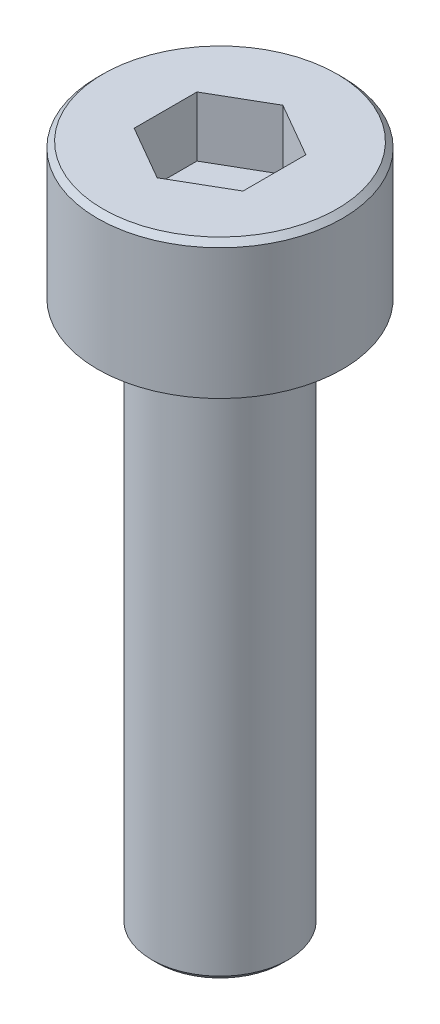
ISO-10303-21;
HEADER;
FILE_DESCRIPTION(('STEP AP214'),'2;1');
FILE_NAME('part.step','',(''),(''),'','','');
FILE_SCHEMA(('AUTOMOTIVE_DESIGN { 1 0 10303 214 1 1 1 1 }'));
ENDSEC;
DATA;
#1=APPLICATION_CONTEXT('core data for automotive mechanical design processes');
#2=APPLICATION_PROTOCOL_DEFINITION('international standard','automotive_design',2000,#1);
#3=PRODUCT_CONTEXT('',#1,'mechanical');
#4=PRODUCT('Part','Part','',(#3));
#5=PRODUCT_RELATED_PRODUCT_CATEGORY('part','',(#4));
#6=PRODUCT_DEFINITION_FORMATION('','',#4);
#7=PRODUCT_DEFINITION_CONTEXT('part definition',#1,'design');
#8=PRODUCT_DEFINITION('design','',#6,#7);
#9=PRODUCT_DEFINITION_SHAPE('','',#8);
#10=(LENGTH_UNIT() NAMED_UNIT(*) SI_UNIT(.MILLI.,.METRE.));
#11=(NAMED_UNIT(*) PLANE_ANGLE_UNIT() SI_UNIT($,.RADIAN.));
#12=(NAMED_UNIT(*) SI_UNIT($,.STERADIAN.) SOLID_ANGLE_UNIT());
#13=UNCERTAINTY_MEASURE_WITH_UNIT(LENGTH_MEASURE(1.E-05),#10,'distance_accuracy_value','');
#14=(GEOMETRIC_REPRESENTATION_CONTEXT(3) GLOBAL_UNCERTAINTY_ASSIGNED_CONTEXT((#13)) GLOBAL_UNIT_ASSIGNED_CONTEXT((#10,
#11,#12)) REPRESENTATION_CONTEXT('',''));
#15=CARTESIAN_POINT('',(0.,0.,0.));
#16=DIRECTION('',(0.,0.,1.));
#17=DIRECTION('',(1.,0.,0.));
#18=AXIS2_PLACEMENT_3D('',#15,#16,#17);
#19=CARTESIAN_POINT('',(1.25,-10.,0.));
#20=DIRECTION('',(0.,1.,0.));
#21=DIRECTION('',(0.,0.,1.));
#22=AXIS2_PLACEMENT_3D('',#19,#20,#21);
#23=PLANE('',#22);
#24=CARTESIAN_POINT('',(0.,-10.,0.));
#25=DIRECTION('',(0.,1.,0.));
#26=DIRECTION('',(0.,0.,1.));
#27=AXIS2_PLACEMENT_3D('',#24,#25,#26);
#28=CIRCLE('',#27,1.15000000000001);
#29=CARTESIAN_POINT('',(0.,-10.,1.15000000000001));
#30=VERTEX_POINT('',#29);
#31=EDGE_CURVE('E11',#30,#30,#28,.F.);
#32=ORIENTED_EDGE('',*,*,#31,.T.);
#33=EDGE_LOOP('',(#32));
#34=FACE_BOUND('',#33,.T.);
#35=ADVANCED_FACE('F34',(#34),#23,.F.);
#36=CARTESIAN_POINT('',(0.,2.5,0.));
#37=DIRECTION('',(0.,-1.,0.));
#38=DIRECTION('',(0.,0.,-1.));
#39=AXIS2_PLACEMENT_3D('',#36,#37,#38);
#40=PLANE('',#39);
#41=DIRECTION('',(-0.866025403784439,0.,0.5));
#42=VECTOR('',#41,1.);
#43=CARTESIAN_POINT('',(0.,2.5,-1.15470053837925));
#44=LINE('',#43,#42);
#45=CARTESIAN_POINT('',(0.,2.5,-1.15470053837925));
#46=VERTEX_POINT('',#45);
#47=CARTESIAN_POINT('',(-1.,2.5,-0.577350269189626));
#48=VERTEX_POINT('',#47);
#49=EDGE_CURVE('E123',#46,#48,#44,.T.);
#50=ORIENTED_EDGE('',*,*,#49,.F.);
#51=DIRECTION('',(-0.866025403784439,0.,-0.5));
#52=VECTOR('',#51,1.);
#53=CARTESIAN_POINT('',(1.,2.5,-0.577350269189626));
#54=LINE('',#53,#52);
#55=CARTESIAN_POINT('',(1.,2.5,-0.577350269189626));
#56=VERTEX_POINT('',#55);
#57=EDGE_CURVE('E49',#56,#46,#54,.T.);
#58=ORIENTED_EDGE('',*,*,#57,.F.);
#59=DIRECTION('',(0.,0.,-1.));
#60=VECTOR('',#59,1.);
#61=CARTESIAN_POINT('',(1.,2.5,0.577350269189626));
#62=LINE('',#61,#60);
#63=CARTESIAN_POINT('',(1.,2.5,0.577350269189626));
#64=VERTEX_POINT('',#63);
#65=EDGE_CURVE('E132',#64,#56,#62,.T.);
#66=ORIENTED_EDGE('',*,*,#65,.F.);
#67=DIRECTION('',(0.866025403784439,0.,-0.5));
#68=VECTOR('',#67,1.);
#69=CARTESIAN_POINT('',(0.,2.5,1.15470053837925));
#70=LINE('',#69,#68);
#71=CARTESIAN_POINT('',(0.,2.5,1.15470053837925));
#72=VERTEX_POINT('',#71);
#73=EDGE_CURVE('E130',#72,#64,#70,.T.);
#74=ORIENTED_EDGE('',*,*,#73,.F.);
#75=DIRECTION('',(0.866025403784438,0.,0.5));
#76=VECTOR('',#75,1.);
#77=CARTESIAN_POINT('',(-1.,2.5,0.577350269189626));
#78=LINE('',#77,#76);
#79=CARTESIAN_POINT('',(-1.,2.5,0.577350269189626));
#80=VERTEX_POINT('',#79);
#81=EDGE_CURVE('E97',#80,#72,#78,.T.);
#82=ORIENTED_EDGE('',*,*,#81,.F.);
#83=DIRECTION('',(0.,0.,1.));
#84=VECTOR('',#83,1.);
#85=CARTESIAN_POINT('',(-1.,2.5,-0.577350269189626));
#86=LINE('',#85,#84);
#87=EDGE_CURVE('E126',#48,#80,#86,.T.);
#88=ORIENTED_EDGE('',*,*,#87,.F.);
#89=EDGE_LOOP('',(#50,#58,#66,#74,#82,#88));
#90=FACE_BOUND('',#89,.T.);
#91=CARTESIAN_POINT('',(0.,2.5,0.));
#92=DIRECTION('',(0.,-1.,0.));
#93=DIRECTION('',(0.,0.,-1.));
#94=AXIS2_PLACEMENT_3D('',#91,#92,#93);
#95=CIRCLE('',#94,2.15000000000001);
#96=CARTESIAN_POINT('',(0.,2.5,-2.15000000000001));
#97=VERTEX_POINT('',#96);
#98=EDGE_CURVE('E147',#97,#97,#95,.F.);
#99=ORIENTED_EDGE('',*,*,#98,.T.);
#100=EDGE_LOOP('',(#99));
#101=FACE_BOUND('',#100,.T.);
#102=ADVANCED_FACE('F171',(#90,#101),#40,.F.);
#103=CARTESIAN_POINT('',(0.,28.3884819972091,0.));
#104=DIRECTION('',(0.,1.,0.));
#105=DIRECTION('',(0.,0.,1.));
#106=AXIS2_PLACEMENT_3D('',#103,#104,#105);
#107=CYLINDRICAL_SURFACE('',#106,2.25);
#108=CARTESIAN_POINT('',(0.,2.4,0.));
#109=DIRECTION('',(0.,-1.,0.));
#110=DIRECTION('',(0.,0.,-1.));
#111=AXIS2_PLACEMENT_3D('',#108,#109,#110);
#112=CIRCLE('',#111,2.25);
#113=CARTESIAN_POINT('',(0.,2.4,-2.25));
#114=VERTEX_POINT('',#113);
#115=EDGE_CURVE('E150',#114,#114,#112,.T.);
#116=ORIENTED_EDGE('',*,*,#115,.T.);
#117=EDGE_LOOP('',(#116));
#118=FACE_BOUND('',#117,.T.);
#119=CARTESIAN_POINT('',(0.,0.,0.));
#120=DIRECTION('',(0.,1.,0.));
#121=DIRECTION('',(0.,0.,1.));
#122=AXIS2_PLACEMENT_3D('',#119,#120,#121);
#123=CIRCLE('',#122,2.25);
#124=CARTESIAN_POINT('',(0.,0.,2.25));
#125=VERTEX_POINT('',#124);
#126=EDGE_CURVE('E144',#125,#125,#123,.T.);
#127=ORIENTED_EDGE('',*,*,#126,.T.);
#128=EDGE_LOOP('',(#127));
#129=FACE_BOUND('',#128,.T.);
#130=ADVANCED_FACE('F177',(#118,#129),#107,.T.);
#131=CARTESIAN_POINT('',(2.25,0.,0.));
#132=DIRECTION('',(0.,1.,0.));
#133=DIRECTION('',(0.,0.,1.));
#134=AXIS2_PLACEMENT_3D('',#131,#132,#133);
#135=PLANE('',#134);
#136=ORIENTED_EDGE('',*,*,#126,.F.);
#137=EDGE_LOOP('',(#136));
#138=FACE_BOUND('',#137,.T.);
#139=CARTESIAN_POINT('',(0.,0.,0.));
#140=DIRECTION('',(0.,1.,0.));
#141=DIRECTION('',(0.,0.,1.));
#142=AXIS2_PLACEMENT_3D('',#139,#140,#141);
#143=CIRCLE('',#142,1.25);
#144=CARTESIAN_POINT('',(0.,0.,1.25));
#145=VERTEX_POINT('',#144);
#146=EDGE_CURVE('E136',#145,#145,#143,.T.);
#147=ORIENTED_EDGE('',*,*,#146,.T.);
#148=EDGE_LOOP('',(#147));
#149=FACE_BOUND('',#148,.T.);
#150=ADVANCED_FACE('F183',(#138,#149),#135,.F.);
#151=CARTESIAN_POINT('',(0.,28.3884819972091,0.));
#152=DIRECTION('',(0.,1.,0.));
#153=DIRECTION('',(0.,0.,1.));
#154=AXIS2_PLACEMENT_3D('',#151,#152,#153);
#155=CYLINDRICAL_SURFACE('',#154,1.25);
#156=CARTESIAN_POINT('',(0.,-9.9,0.));
#157=DIRECTION('',(0.,1.,0.));
#158=DIRECTION('',(0.,0.,1.));
#159=AXIS2_PLACEMENT_3D('',#156,#157,#158);
#160=CIRCLE('',#159,1.25);
#161=CARTESIAN_POINT('',(0.,-9.9,1.25));
#162=VERTEX_POINT('',#161);
#163=EDGE_CURVE('E42',#162,#162,#160,.T.);
#164=ORIENTED_EDGE('',*,*,#163,.T.);
#165=EDGE_LOOP('',(#164));
#166=FACE_BOUND('',#165,.T.);
#167=ORIENTED_EDGE('',*,*,#146,.F.);
#168=EDGE_LOOP('',(#167));
#169=FACE_BOUND('',#168,.T.);
#170=ADVANCED_FACE('F155',(#166,#169),#155,.T.);
#171=CARTESIAN_POINT('',(0.,2.5,0.));
#172=DIRECTION('',(0.,-1.,0.));
#173=DIRECTION('',(0.,0.,-1.));
#174=AXIS2_PLACEMENT_3D('',#171,#172,#173);
#175=CONICAL_SURFACE('',#174,2.15000000000001,0.785398163397448);
#176=ORIENTED_EDGE('',*,*,#115,.F.);
#177=EDGE_LOOP('',(#176));
#178=FACE_BOUND('',#177,.T.);
#179=ORIENTED_EDGE('',*,*,#98,.F.);
#180=EDGE_LOOP('',(#179));
#181=FACE_BOUND('',#180,.T.);
#182=ADVANCED_FACE('F160',(#178,#181),#175,.T.);
#183=CARTESIAN_POINT('',(0.,-9.9,0.));
#184=DIRECTION('',(0.,1.,0.));
#185=DIRECTION('',(0.,0.,1.));
#186=AXIS2_PLACEMENT_3D('',#183,#184,#185);
#187=CONICAL_SURFACE('',#186,1.25,0.785398163397429);
#188=ORIENTED_EDGE('',*,*,#31,.F.);
#189=EDGE_LOOP('',(#188));
#190=FACE_BOUND('',#189,.T.);
#191=ORIENTED_EDGE('',*,*,#163,.F.);
#192=EDGE_LOOP('',(#191));
#193=FACE_BOUND('',#192,.T.);
#194=ADVANCED_FACE('F36',(#190,#193),#187,.T.);
#195=CARTESIAN_POINT('',(1.,1.4,-0.577350269189626));
#196=DIRECTION('',(0.5,0.,-0.866025403784439));
#197=DIRECTION('',(-0.866025403784439,0.,-0.5));
#198=AXIS2_PLACEMENT_3D('',#195,#196,#197);
#199=PLANE('',#198);
#200=ORIENTED_EDGE('',*,*,#57,.T.);
#201=DIRECTION('',(0.,1.,0.));
#202=VECTOR('',#201,1.);
#203=CARTESIAN_POINT('',(0.,1.4,-1.15470053837925));
#204=LINE('',#203,#202);
#205=CARTESIAN_POINT('',(0.,1.4,-1.15470053837925));
#206=VERTEX_POINT('',#205);
#207=EDGE_CURVE('E79',#206,#46,#204,.T.);
#208=ORIENTED_EDGE('',*,*,#207,.F.);
#209=DIRECTION('',(-0.866025403784439,0.,-0.5));
#210=VECTOR('',#209,1.);
#211=CARTESIAN_POINT('',(1.,1.4,-0.577350269189626));
#212=LINE('',#211,#210);
#213=CARTESIAN_POINT('',(1.,1.4,-0.577350269189626));
#214=VERTEX_POINT('',#213);
#215=EDGE_CURVE('E134',#214,#206,#212,.T.);
#216=ORIENTED_EDGE('',*,*,#215,.F.);
#217=DIRECTION('',(0.,1.,0.));
#218=VECTOR('',#217,1.);
#219=CARTESIAN_POINT('',(1.,1.4,-0.577350269189626));
#220=LINE('',#219,#218);
#221=EDGE_CURVE('E57',#214,#56,#220,.T.);
#222=ORIENTED_EDGE('',*,*,#221,.T.);
#223=EDGE_LOOP('',(#200,#208,#216,#222));
#224=FACE_BOUND('',#223,.T.);
#225=ADVANCED_FACE('F159',(#224),#199,.F.);
#226=CARTESIAN_POINT('',(1.,1.4,0.577350269189626));
#227=DIRECTION('',(1.,0.,0.));
#228=DIRECTION('',(0.,0.,-1.));
#229=AXIS2_PLACEMENT_3D('',#226,#227,#228);
#230=PLANE('',#229);
#231=ORIENTED_EDGE('',*,*,#65,.T.);
#232=ORIENTED_EDGE('',*,*,#221,.F.);
#233=DIRECTION('',(0.,0.,-1.));
#234=VECTOR('',#233,1.);
#235=CARTESIAN_POINT('',(1.,1.4,0.577350269189626));
#236=LINE('',#235,#234);
#237=CARTESIAN_POINT('',(1.,1.4,0.577350269189626));
#238=VERTEX_POINT('',#237);
#239=EDGE_CURVE('E109',#238,#214,#236,.T.);
#240=ORIENTED_EDGE('',*,*,#239,.F.);
#241=DIRECTION('',(0.,1.,0.));
#242=VECTOR('',#241,1.);
#243=CARTESIAN_POINT('',(1.,1.4,0.577350269189626));
#244=LINE('',#243,#242);
#245=EDGE_CURVE('E101',#238,#64,#244,.T.);
#246=ORIENTED_EDGE('',*,*,#245,.T.);
#247=EDGE_LOOP('',(#231,#232,#240,#246));
#248=FACE_BOUND('',#247,.T.);
#249=ADVANCED_FACE('F166',(#248),#230,.F.);
#250=CARTESIAN_POINT('',(0.,1.4,1.15470053837925));
#251=DIRECTION('',(0.5,0.,0.866025403784439));
#252=DIRECTION('',(0.866025403784439,0.,-0.5));
#253=AXIS2_PLACEMENT_3D('',#250,#251,#252);
#254=PLANE('',#253);
#255=ORIENTED_EDGE('',*,*,#73,.T.);
#256=ORIENTED_EDGE('',*,*,#245,.F.);
#257=DIRECTION('',(0.866025403784439,0.,-0.5));
#258=VECTOR('',#257,1.);
#259=CARTESIAN_POINT('',(0.,1.4,1.15470053837925));
#260=LINE('',#259,#258);
#261=CARTESIAN_POINT('',(0.,1.4,1.15470053837925));
#262=VERTEX_POINT('',#261);
#263=EDGE_CURVE('E105',#262,#238,#260,.T.);
#264=ORIENTED_EDGE('',*,*,#263,.F.);
#265=DIRECTION('',(0.,1.,0.));
#266=VECTOR('',#265,1.);
#267=CARTESIAN_POINT('',(0.,1.4,1.15470053837925));
#268=LINE('',#267,#266);
#269=EDGE_CURVE('E90',#262,#72,#268,.T.);
#270=ORIENTED_EDGE('',*,*,#269,.T.);
#271=EDGE_LOOP('',(#255,#256,#264,#270));
#272=FACE_BOUND('',#271,.T.);
#273=ADVANCED_FACE('F106',(#272),#254,.F.);
#274=CARTESIAN_POINT('',(-1.,1.4,0.577350269189626));
#275=DIRECTION('',(-0.5,0.,0.866025403784439));
#276=DIRECTION('',(0.866025403784438,0.,0.5));
#277=AXIS2_PLACEMENT_3D('',#274,#275,#276);
#278=PLANE('',#277);
#279=ORIENTED_EDGE('',*,*,#81,.T.);
#280=ORIENTED_EDGE('',*,*,#269,.F.);
#281=DIRECTION('',(0.866025403784438,0.,0.5));
#282=VECTOR('',#281,1.);
#283=CARTESIAN_POINT('',(-1.,1.4,0.577350269189626));
#284=LINE('',#283,#282);
#285=CARTESIAN_POINT('',(-1.,1.4,0.577350269189626));
#286=VERTEX_POINT('',#285);
#287=EDGE_CURVE('E94',#286,#262,#284,.T.);
#288=ORIENTED_EDGE('',*,*,#287,.F.);
#289=DIRECTION('',(0.,1.,0.));
#290=VECTOR('',#289,1.);
#291=CARTESIAN_POINT('',(-1.,1.4,0.577350269189626));
#292=LINE('',#291,#290);
#293=EDGE_CURVE('E102',#286,#80,#292,.T.);
#294=ORIENTED_EDGE('',*,*,#293,.T.);
#295=EDGE_LOOP('',(#279,#280,#288,#294));
#296=FACE_BOUND('',#295,.T.);
#297=ADVANCED_FACE('F92',(#296),#278,.F.);
#298=CARTESIAN_POINT('',(-1.,1.4,-0.577350269189626));
#299=DIRECTION('',(-1.,0.,0.));
#300=DIRECTION('',(0.,0.,1.));
#301=AXIS2_PLACEMENT_3D('',#298,#299,#300);
#302=PLANE('',#301);
#303=ORIENTED_EDGE('',*,*,#87,.T.);
#304=ORIENTED_EDGE('',*,*,#293,.F.);
#305=DIRECTION('',(0.,0.,1.));
#306=VECTOR('',#305,1.);
#307=CARTESIAN_POINT('',(-1.,1.4,-0.577350269189626));
#308=LINE('',#307,#306);
#309=CARTESIAN_POINT('',(-1.,1.4,-0.577350269189626));
#310=VERTEX_POINT('',#309);
#311=EDGE_CURVE('E115',#310,#286,#308,.T.);
#312=ORIENTED_EDGE('',*,*,#311,.F.);
#313=DIRECTION('',(0.,1.,0.));
#314=VECTOR('',#313,1.);
#315=CARTESIAN_POINT('',(-1.,1.4,-0.577350269189626));
#316=LINE('',#315,#314);
#317=EDGE_CURVE('E139',#310,#48,#316,.T.);
#318=ORIENTED_EDGE('',*,*,#317,.T.);
#319=EDGE_LOOP('',(#303,#304,#312,#318));
#320=FACE_BOUND('',#319,.T.);
#321=ADVANCED_FACE('F193',(#320),#302,.F.);
#322=CARTESIAN_POINT('',(0.,1.4,-1.15470053837925));
#323=DIRECTION('',(-0.5,0.,-0.866025403784439));
#324=DIRECTION('',(-0.866025403784439,0.,0.5));
#325=AXIS2_PLACEMENT_3D('',#322,#323,#324);
#326=PLANE('',#325);
#327=ORIENTED_EDGE('',*,*,#49,.T.);
#328=ORIENTED_EDGE('',*,*,#317,.F.);
#329=DIRECTION('',(-0.866025403784439,0.,0.5));
#330=VECTOR('',#329,1.);
#331=CARTESIAN_POINT('',(0.,1.4,-1.15470053837925));
#332=LINE('',#331,#330);
#333=EDGE_CURVE('E117',#206,#310,#332,.T.);
#334=ORIENTED_EDGE('',*,*,#333,.F.);
#335=ORIENTED_EDGE('',*,*,#207,.T.);
#336=EDGE_LOOP('',(#327,#328,#334,#335));
#337=FACE_BOUND('',#336,.T.);
#338=ADVANCED_FACE('F190',(#337),#326,.F.);
#339=CARTESIAN_POINT('',(0.,1.4,-1.15470053837925));
#340=DIRECTION('',(0.,1.,0.));
#341=DIRECTION('',(0.,0.,1.));
#342=AXIS2_PLACEMENT_3D('',#339,#340,#341);
#343=PLANE('',#342);
#344=ORIENTED_EDGE('',*,*,#215,.T.);
#345=ORIENTED_EDGE('',*,*,#333,.T.);
#346=ORIENTED_EDGE('',*,*,#311,.T.);
#347=ORIENTED_EDGE('',*,*,#287,.T.);
#348=ORIENTED_EDGE('',*,*,#263,.T.);
#349=ORIENTED_EDGE('',*,*,#239,.T.);
#350=EDGE_LOOP('',(#344,#345,#346,#347,#348,#349));
#351=FACE_BOUND('',#350,.T.);
#352=ADVANCED_FACE('F112',(#351),#343,.T.);
#353=CLOSED_SHELL('',(#35,#102,#130,#150,#170,#182,#194,#225,#249,#273,#297,#321,#338,#352));
#354=MANIFOLD_SOLID_BREP('B2',#353);
#355=ADVANCED_BREP_SHAPE_REPRESENTATION('',(#18,#354),#14);
#356=SHAPE_DEFINITION_REPRESENTATION(#9,#355);
ENDSEC;
END-ISO-10303-21;
